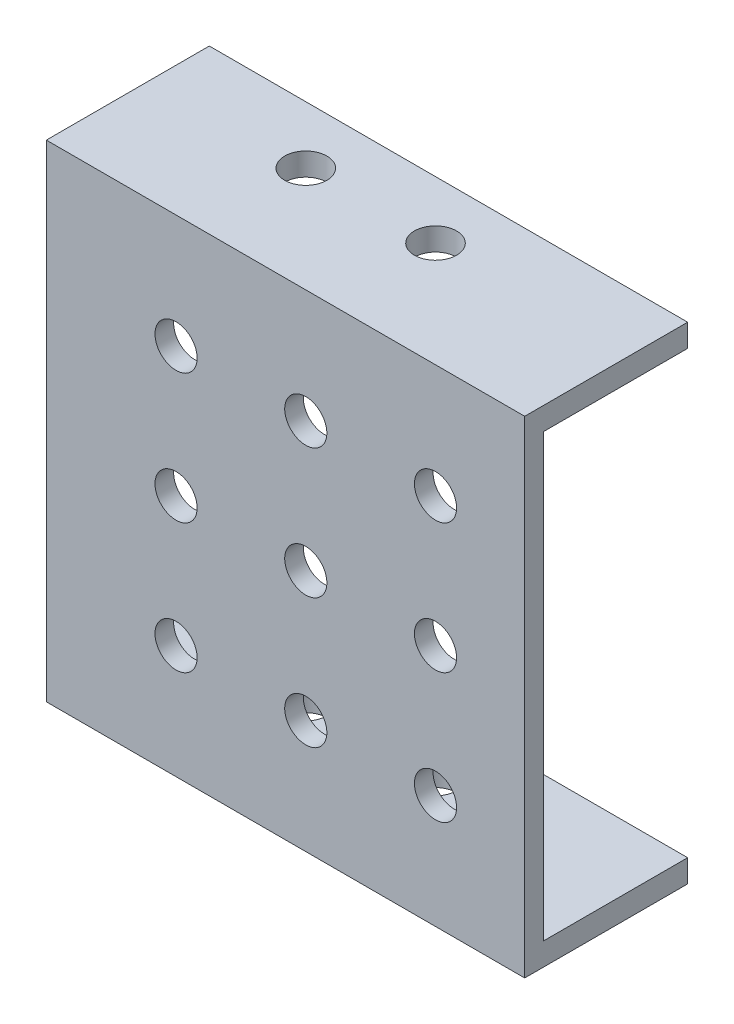
ISO-10303-21;
HEADER;
FILE_DESCRIPTION(('STEP AP214'),'2;1');
FILE_NAME('part.step','',(''),(''),'','','');
FILE_SCHEMA(('AUTOMOTIVE_DESIGN { 1 0 10303 214 1 1 1 1 }'));
ENDSEC;
DATA;
#1=APPLICATION_CONTEXT('core data for automotive mechanical design processes');
#2=APPLICATION_PROTOCOL_DEFINITION('international standard','automotive_design',2000,#1);
#3=PRODUCT_CONTEXT('',#1,'mechanical');
#4=PRODUCT('Part','Part','',(#3));
#5=PRODUCT_RELATED_PRODUCT_CATEGORY('part','',(#4));
#6=PRODUCT_DEFINITION_FORMATION('','',#4);
#7=PRODUCT_DEFINITION_CONTEXT('part definition',#1,'design');
#8=PRODUCT_DEFINITION('design','',#6,#7);
#9=PRODUCT_DEFINITION_SHAPE('','',#8);
#10=(LENGTH_UNIT() NAMED_UNIT(*) SI_UNIT(.MILLI.,.METRE.));
#11=(NAMED_UNIT(*) PLANE_ANGLE_UNIT() SI_UNIT($,.RADIAN.));
#12=(NAMED_UNIT(*) SI_UNIT($,.STERADIAN.) SOLID_ANGLE_UNIT());
#13=UNCERTAINTY_MEASURE_WITH_UNIT(LENGTH_MEASURE(1.E-05),#10,'distance_accuracy_value','');
#14=(GEOMETRIC_REPRESENTATION_CONTEXT(3) GLOBAL_UNCERTAINTY_ASSIGNED_CONTEXT((#13)) GLOBAL_UNIT_ASSIGNED_CONTEXT((#10,
#11,#12)) REPRESENTATION_CONTEXT('',''));
#15=CARTESIAN_POINT('',(0.,0.,0.));
#16=DIRECTION('',(0.,0.,1.));
#17=DIRECTION('',(1.,0.,0.));
#18=AXIS2_PLACEMENT_3D('',#15,#16,#17);
#19=CARTESIAN_POINT('',(-147.5,0.,0.));
#20=DIRECTION('',(0.,0.,1.));
#21=DIRECTION('',(1.,0.,0.));
#22=AXIS2_PLACEMENT_3D('',#19,#20,#21);
#23=PLANE('',#22);
#24=CARTESIAN_POINT('',(12.5,70.,0.));
#25=DIRECTION('',(0.,0.,1.));
#26=DIRECTION('',(1.,0.,0.));
#27=AXIS2_PLACEMENT_3D('',#24,#25,#26);
#28=CIRCLE('',#27,13.);
#29=CARTESIAN_POINT('',(25.5,70.,0.));
#30=VERTEX_POINT('',#29);
#31=EDGE_CURVE('E223',#30,#30,#28,.T.);
#32=ORIENTED_EDGE('',*,*,#31,.T.);
#33=EDGE_LOOP('',(#32));
#34=FACE_BOUND('',#33,.T.);
#35=CARTESIAN_POINT('',(-67.4999999999999,150.,0.));
#36=DIRECTION('',(0.,0.,1.));
#37=DIRECTION('',(1.,0.,0.));
#38=AXIS2_PLACEMENT_3D('',#35,#36,#37);
#39=CIRCLE('',#38,13.);
#40=CARTESIAN_POINT('',(-54.4999999999999,150.,0.));
#41=VERTEX_POINT('',#40);
#42=EDGE_CURVE('E235',#41,#41,#39,.T.);
#43=ORIENTED_EDGE('',*,*,#42,.T.);
#44=EDGE_LOOP('',(#43));
#45=FACE_BOUND('',#44,.T.);
#46=CARTESIAN_POINT('',(12.5,230.,0.));
#47=DIRECTION('',(0.,0.,1.));
#48=DIRECTION('',(1.,0.,0.));
#49=AXIS2_PLACEMENT_3D('',#46,#47,#48);
#50=CIRCLE('',#49,13.);
#51=CARTESIAN_POINT('',(25.5,230.,0.));
#52=VERTEX_POINT('',#51);
#53=EDGE_CURVE('E245',#52,#52,#50,.T.);
#54=ORIENTED_EDGE('',*,*,#53,.T.);
#55=EDGE_LOOP('',(#54));
#56=FACE_BOUND('',#55,.T.);
#57=CARTESIAN_POINT('',(92.5,150.,0.));
#58=DIRECTION('',(0.,0.,1.));
#59=DIRECTION('',(1.,0.,0.));
#60=AXIS2_PLACEMENT_3D('',#57,#58,#59);
#61=CIRCLE('',#60,13.);
#62=CARTESIAN_POINT('',(105.5,150.,0.));
#63=VERTEX_POINT('',#62);
#64=EDGE_CURVE('E255',#63,#63,#61,.T.);
#65=ORIENTED_EDGE('',*,*,#64,.T.);
#66=EDGE_LOOP('',(#65));
#67=FACE_BOUND('',#66,.T.);
#68=CARTESIAN_POINT('',(92.5,230.,0.));
#69=DIRECTION('',(0.,0.,1.));
#70=DIRECTION('',(1.,0.,0.));
#71=AXIS2_PLACEMENT_3D('',#68,#69,#70);
#72=CIRCLE('',#71,13.);
#73=CARTESIAN_POINT('',(105.5,230.,0.));
#74=VERTEX_POINT('',#73);
#75=EDGE_CURVE('E196',#74,#74,#72,.T.);
#76=ORIENTED_EDGE('',*,*,#75,.T.);
#77=EDGE_LOOP('',(#76));
#78=FACE_BOUND('',#77,.T.);
#79=CARTESIAN_POINT('',(92.5,70.,0.));
#80=DIRECTION('',(0.,0.,1.));
#81=DIRECTION('',(1.,0.,0.));
#82=AXIS2_PLACEMENT_3D('',#79,#80,#81);
#83=CIRCLE('',#82,13.);
#84=CARTESIAN_POINT('',(105.5,70.,0.));
#85=VERTEX_POINT('',#84);
#86=EDGE_CURVE('E251',#85,#85,#83,.T.);
#87=ORIENTED_EDGE('',*,*,#86,.T.);
#88=EDGE_LOOP('',(#87));
#89=FACE_BOUND('',#88,.T.);
#90=CARTESIAN_POINT('',(-67.4999999999999,230.,0.));
#91=DIRECTION('',(0.,0.,1.));
#92=DIRECTION('',(1.,0.,0.));
#93=AXIS2_PLACEMENT_3D('',#90,#91,#92);
#94=CIRCLE('',#93,13.);
#95=CARTESIAN_POINT('',(-54.4999999999999,230.,0.));
#96=VERTEX_POINT('',#95);
#97=EDGE_CURVE('E241',#96,#96,#94,.T.);
#98=ORIENTED_EDGE('',*,*,#97,.T.);
#99=EDGE_LOOP('',(#98));
#100=FACE_BOUND('',#99,.T.);
#101=CARTESIAN_POINT('',(-67.4999999999999,70.,0.));
#102=DIRECTION('',(0.,0.,1.));
#103=DIRECTION('',(1.,0.,0.));
#104=AXIS2_PLACEMENT_3D('',#101,#102,#103);
#105=CIRCLE('',#104,13.);
#106=CARTESIAN_POINT('',(-54.5,70.,0.));
#107=VERTEX_POINT('',#106);
#108=EDGE_CURVE('E232',#107,#107,#105,.T.);
#109=ORIENTED_EDGE('',*,*,#108,.T.);
#110=EDGE_LOOP('',(#109));
#111=FACE_BOUND('',#110,.T.);
#112=CARTESIAN_POINT('',(12.5,150.,0.));
#113=DIRECTION('',(0.,0.,1.));
#114=DIRECTION('',(1.,0.,0.));
#115=AXIS2_PLACEMENT_3D('',#112,#113,#114);
#116=CIRCLE('',#115,13.);
#117=CARTESIAN_POINT('',(25.5,150.,0.));
#118=VERTEX_POINT('',#117);
#119=EDGE_CURVE('E162',#118,#118,#116,.T.);
#120=ORIENTED_EDGE('',*,*,#119,.T.);
#121=EDGE_LOOP('',(#120));
#122=FACE_BOUND('',#121,.T.);
#123=DIRECTION('',(1.,0.,0.));
#124=VECTOR('',#123,1.);
#125=CARTESIAN_POINT('',(147.5,14.,0.));
#126=LINE('',#125,#124);
#127=CARTESIAN_POINT('',(-147.5,14.,0.));
#128=VERTEX_POINT('',#127);
#129=CARTESIAN_POINT('',(147.5,14.,0.));
#130=VERTEX_POINT('',#129);
#131=EDGE_CURVE('E120',#128,#130,#126,.T.);
#132=ORIENTED_EDGE('',*,*,#131,.F.);
#133=DIRECTION('',(0.,-1.,0.));
#134=VECTOR('',#133,1.);
#135=CARTESIAN_POINT('',(-147.5,300.,0.));
#136=LINE('',#135,#134);
#137=CARTESIAN_POINT('',(-147.5,286.,0.));
#138=VERTEX_POINT('',#137);
#139=EDGE_CURVE('E153',#138,#128,#136,.T.);
#140=ORIENTED_EDGE('',*,*,#139,.F.);
#141=DIRECTION('',(-1.,0.,0.));
#142=VECTOR('',#141,1.);
#143=CARTESIAN_POINT('',(147.5,286.,0.));
#144=LINE('',#143,#142);
#145=CARTESIAN_POINT('',(147.5,286.,0.));
#146=VERTEX_POINT('',#145);
#147=EDGE_CURVE('E132',#146,#138,#144,.T.);
#148=ORIENTED_EDGE('',*,*,#147,.F.);
#149=DIRECTION('',(0.,1.,0.));
#150=VECTOR('',#149,1.);
#151=CARTESIAN_POINT('',(147.5,300.,0.));
#152=LINE('',#151,#150);
#153=EDGE_CURVE('E56',#130,#146,#152,.T.);
#154=ORIENTED_EDGE('',*,*,#153,.F.);
#155=EDGE_LOOP('',(#132,#140,#148,#154));
#156=FACE_BOUND('',#155,.T.);
#157=ADVANCED_FACE('F34',(#34,#45,#56,#67,#78,#89,#100,#111,#122,#156),#23,.F.);
#158=CARTESIAN_POINT('',(-147.5,0.,11.5));
#159=DIRECTION('',(0.,0.,1.));
#160=DIRECTION('',(1.,0.,0.));
#161=AXIS2_PLACEMENT_3D('',#158,#159,#160);
#162=PLANE('',#161);
#163=CARTESIAN_POINT('',(12.5,70.,11.5));
#164=DIRECTION('',(0.,0.,1.));
#165=DIRECTION('',(1.,0.,0.));
#166=AXIS2_PLACEMENT_3D('',#163,#164,#165);
#167=CIRCLE('',#166,13.);
#168=CARTESIAN_POINT('',(25.5,70.,11.5));
#169=VERTEX_POINT('',#168);
#170=EDGE_CURVE('E225',#169,#169,#167,.T.);
#171=ORIENTED_EDGE('',*,*,#170,.F.);
#172=EDGE_LOOP('',(#171));
#173=FACE_BOUND('',#172,.T.);
#174=CARTESIAN_POINT('',(-67.4999999999999,150.,11.5));
#175=DIRECTION('',(0.,0.,1.));
#176=DIRECTION('',(1.,0.,0.));
#177=AXIS2_PLACEMENT_3D('',#174,#175,#176);
#178=CIRCLE('',#177,13.);
#179=CARTESIAN_POINT('',(-54.4999999999999,150.,11.5));
#180=VERTEX_POINT('',#179);
#181=EDGE_CURVE('E238',#180,#180,#178,.T.);
#182=ORIENTED_EDGE('',*,*,#181,.F.);
#183=EDGE_LOOP('',(#182));
#184=FACE_BOUND('',#183,.T.);
#185=CARTESIAN_POINT('',(12.5,230.,11.5));
#186=DIRECTION('',(0.,0.,1.));
#187=DIRECTION('',(1.,0.,0.));
#188=AXIS2_PLACEMENT_3D('',#185,#186,#187);
#189=CIRCLE('',#188,13.);
#190=CARTESIAN_POINT('',(25.5,230.,11.5));
#191=VERTEX_POINT('',#190);
#192=EDGE_CURVE('E248',#191,#191,#189,.T.);
#193=ORIENTED_EDGE('',*,*,#192,.F.);
#194=EDGE_LOOP('',(#193));
#195=FACE_BOUND('',#194,.T.);
#196=CARTESIAN_POINT('',(92.5,150.,11.5));
#197=DIRECTION('',(0.,0.,1.));
#198=DIRECTION('',(1.,0.,0.));
#199=AXIS2_PLACEMENT_3D('',#196,#197,#198);
#200=CIRCLE('',#199,13.);
#201=CARTESIAN_POINT('',(105.5,150.,11.5));
#202=VERTEX_POINT('',#201);
#203=EDGE_CURVE('E258',#202,#202,#200,.T.);
#204=ORIENTED_EDGE('',*,*,#203,.F.);
#205=EDGE_LOOP('',(#204));
#206=FACE_BOUND('',#205,.T.);
#207=DIRECTION('',(0.,-1.,0.));
#208=VECTOR('',#207,1.);
#209=CARTESIAN_POINT('',(-147.5,300.,11.5));
#210=LINE('',#209,#208);
#211=CARTESIAN_POINT('',(-147.5,300.,11.5));
#212=VERTEX_POINT('',#211);
#213=CARTESIAN_POINT('',(-147.5,0.,11.5));
#214=VERTEX_POINT('',#213);
#215=EDGE_CURVE('E166',#212,#214,#210,.T.);
#216=ORIENTED_EDGE('',*,*,#215,.T.);
#217=DIRECTION('',(1.,0.,0.));
#218=VECTOR('',#217,1.);
#219=CARTESIAN_POINT('',(-147.5,0.,11.5));
#220=LINE('',#219,#218);
#221=CARTESIAN_POINT('',(147.5,0.,11.5));
#222=VERTEX_POINT('',#221);
#223=EDGE_CURVE('E192',#214,#222,#220,.T.);
#224=ORIENTED_EDGE('',*,*,#223,.T.);
#225=DIRECTION('',(0.,1.,0.));
#226=VECTOR('',#225,1.);
#227=CARTESIAN_POINT('',(147.5,300.,11.5));
#228=LINE('',#227,#226);
#229=CARTESIAN_POINT('',(147.5,300.,11.5));
#230=VERTEX_POINT('',#229);
#231=EDGE_CURVE('E105',#222,#230,#228,.T.);
#232=ORIENTED_EDGE('',*,*,#231,.T.);
#233=DIRECTION('',(-1.,0.,0.));
#234=VECTOR('',#233,1.);
#235=CARTESIAN_POINT('',(-147.5,300.,11.5));
#236=LINE('',#235,#234);
#237=EDGE_CURVE('E174',#230,#212,#236,.T.);
#238=ORIENTED_EDGE('',*,*,#237,.T.);
#239=EDGE_LOOP('',(#216,#224,#232,#238));
#240=FACE_BOUND('',#239,.T.);
#241=CARTESIAN_POINT('',(92.5,230.,11.5));
#242=DIRECTION('',(0.,0.,1.));
#243=DIRECTION('',(1.,0.,0.));
#244=AXIS2_PLACEMENT_3D('',#241,#242,#243);
#245=CIRCLE('',#244,13.);
#246=CARTESIAN_POINT('',(105.5,230.,11.5));
#247=VERTEX_POINT('',#246);
#248=EDGE_CURVE('E207',#247,#247,#245,.T.);
#249=ORIENTED_EDGE('',*,*,#248,.F.);
#250=EDGE_LOOP('',(#249));
#251=FACE_BOUND('',#250,.T.);
#252=CARTESIAN_POINT('',(92.5,70.,11.5));
#253=DIRECTION('',(0.,0.,1.));
#254=DIRECTION('',(1.,0.,0.));
#255=AXIS2_PLACEMENT_3D('',#252,#253,#254);
#256=CIRCLE('',#255,13.);
#257=CARTESIAN_POINT('',(105.5,70.,11.5));
#258=VERTEX_POINT('',#257);
#259=EDGE_CURVE('E211',#258,#258,#256,.T.);
#260=ORIENTED_EDGE('',*,*,#259,.F.);
#261=EDGE_LOOP('',(#260));
#262=FACE_BOUND('',#261,.T.);
#263=CARTESIAN_POINT('',(-67.4999999999999,230.,11.5));
#264=DIRECTION('',(0.,0.,1.));
#265=DIRECTION('',(1.,0.,0.));
#266=AXIS2_PLACEMENT_3D('',#263,#264,#265);
#267=CIRCLE('',#266,13.);
#268=CARTESIAN_POINT('',(-54.4999999999999,230.,11.5));
#269=VERTEX_POINT('',#268);
#270=EDGE_CURVE('E215',#269,#269,#267,.T.);
#271=ORIENTED_EDGE('',*,*,#270,.F.);
#272=EDGE_LOOP('',(#271));
#273=FACE_BOUND('',#272,.T.);
#274=CARTESIAN_POINT('',(-67.4999999999999,70.,11.5));
#275=DIRECTION('',(0.,0.,1.));
#276=DIRECTION('',(1.,0.,0.));
#277=AXIS2_PLACEMENT_3D('',#274,#275,#276);
#278=CIRCLE('',#277,13.);
#279=CARTESIAN_POINT('',(-54.5,70.,11.5));
#280=VERTEX_POINT('',#279);
#281=EDGE_CURVE('E219',#280,#280,#278,.T.);
#282=ORIENTED_EDGE('',*,*,#281,.F.);
#283=EDGE_LOOP('',(#282));
#284=FACE_BOUND('',#283,.T.);
#285=CARTESIAN_POINT('',(12.5,150.,11.5));
#286=DIRECTION('',(0.,0.,1.));
#287=DIRECTION('',(1.,0.,0.));
#288=AXIS2_PLACEMENT_3D('',#285,#286,#287);
#289=CIRCLE('',#288,13.);
#290=CARTESIAN_POINT('',(25.5,150.,11.5));
#291=VERTEX_POINT('',#290);
#292=EDGE_CURVE('E147',#291,#291,#289,.T.);
#293=ORIENTED_EDGE('',*,*,#292,.F.);
#294=EDGE_LOOP('',(#293));
#295=FACE_BOUND('',#294,.T.);
#296=ADVANCED_FACE('F199',(#173,#184,#195,#206,#240,#251,#262,#273,#284,#295),#162,.T.);
#297=CARTESIAN_POINT('',(-147.5,300.,11.5));
#298=DIRECTION('',(1.,0.,0.));
#299=DIRECTION('',(0.,0.,-1.));
#300=AXIS2_PLACEMENT_3D('',#297,#298,#299);
#301=PLANE('',#300);
#302=DIRECTION('',(0.,0.,-1.));
#303=VECTOR('',#302,1.);
#304=CARTESIAN_POINT('',(-147.5,300.,11.5));
#305=LINE('',#304,#303);
#306=CARTESIAN_POINT('',(-147.5,300.,-89.));
#307=VERTEX_POINT('',#306);
#308=EDGE_CURVE('E172',#212,#307,#305,.T.);
#309=ORIENTED_EDGE('',*,*,#308,.T.);
#310=DIRECTION('',(0.,1.,0.));
#311=VECTOR('',#310,1.);
#312=CARTESIAN_POINT('',(-147.5,300.,-89.));
#313=LINE('',#312,#311);
#314=CARTESIAN_POINT('',(-147.5,286.,-89.));
#315=VERTEX_POINT('',#314);
#316=EDGE_CURVE('E138',#315,#307,#313,.T.);
#317=ORIENTED_EDGE('',*,*,#316,.F.);
#318=DIRECTION('',(0.,0.,1.));
#319=VECTOR('',#318,1.);
#320=CARTESIAN_POINT('',(-147.5,286.,-89.));
#321=LINE('',#320,#319);
#322=EDGE_CURVE('E144',#315,#138,#321,.T.);
#323=ORIENTED_EDGE('',*,*,#322,.T.);
#324=ORIENTED_EDGE('',*,*,#139,.T.);
#325=DIRECTION('',(0.,0.,1.));
#326=VECTOR('',#325,1.);
#327=CARTESIAN_POINT('',(-147.5,14.,-89.));
#328=LINE('',#327,#326);
#329=CARTESIAN_POINT('',(-147.5,14.,-89.));
#330=VERTEX_POINT('',#329);
#331=EDGE_CURVE('E130',#330,#128,#328,.T.);
#332=ORIENTED_EDGE('',*,*,#331,.F.);
#333=DIRECTION('',(0.,1.,0.));
#334=VECTOR('',#333,1.);
#335=CARTESIAN_POINT('',(-147.5,0.,-89.));
#336=LINE('',#335,#334);
#337=CARTESIAN_POINT('',(-147.5,0.,-89.));
#338=VERTEX_POINT('',#337);
#339=EDGE_CURVE('E115',#338,#330,#336,.T.);
#340=ORIENTED_EDGE('',*,*,#339,.F.);
#341=DIRECTION('',(0.,0.,-1.));
#342=VECTOR('',#341,1.);
#343=CARTESIAN_POINT('',(-147.5,0.,11.5));
#344=LINE('',#343,#342);
#345=EDGE_CURVE('E11',#214,#338,#344,.T.);
#346=ORIENTED_EDGE('',*,*,#345,.F.);
#347=ORIENTED_EDGE('',*,*,#215,.F.);
#348=EDGE_LOOP('',(#309,#317,#323,#324,#332,#340,#346,#347));
#349=FACE_BOUND('',#348,.T.);
#350=ADVANCED_FACE('F36',(#349),#301,.F.);
#351=CARTESIAN_POINT('',(-147.5,0.,11.5));
#352=DIRECTION('',(0.,1.,0.));
#353=DIRECTION('',(0.,0.,1.));
#354=AXIS2_PLACEMENT_3D('',#351,#352,#353);
#355=PLANE('',#354);
#356=CARTESIAN_POINT('',(-52.5,0.,-53.5));
#357=DIRECTION('',(0.,1.,0.));
#358=DIRECTION('',(0.,0.,1.));
#359=AXIS2_PLACEMENT_3D('',#356,#357,#358);
#360=CIRCLE('',#359,13.);
#361=CARTESIAN_POINT('',(-52.5,0.,-40.5));
#362=VERTEX_POINT('',#361);
#363=EDGE_CURVE('E297',#362,#362,#360,.T.);
#364=ORIENTED_EDGE('',*,*,#363,.T.);
#365=EDGE_LOOP('',(#364));
#366=FACE_BOUND('',#365,.T.);
#367=CARTESIAN_POINT('',(27.5,0.,-53.5));
#368=DIRECTION('',(0.,1.,0.));
#369=DIRECTION('',(0.,0.,1.));
#370=AXIS2_PLACEMENT_3D('',#367,#368,#369);
#371=CIRCLE('',#370,13.);
#372=CARTESIAN_POINT('',(27.5,0.,-40.5));
#373=VERTEX_POINT('',#372);
#374=EDGE_CURVE('E300',#373,#373,#371,.T.);
#375=ORIENTED_EDGE('',*,*,#374,.T.);
#376=EDGE_LOOP('',(#375));
#377=FACE_BOUND('',#376,.T.);
#378=ORIENTED_EDGE('',*,*,#345,.T.);
#379=DIRECTION('',(-1.,0.,0.));
#380=VECTOR('',#379,1.);
#381=CARTESIAN_POINT('',(147.5,0.,-89.));
#382=LINE('',#381,#380);
#383=CARTESIAN_POINT('',(147.5,0.,-89.));
#384=VERTEX_POINT('',#383);
#385=EDGE_CURVE('E110',#384,#338,#382,.T.);
#386=ORIENTED_EDGE('',*,*,#385,.F.);
#387=DIRECTION('',(0.,0.,-1.));
#388=VECTOR('',#387,1.);
#389=CARTESIAN_POINT('',(147.5,0.,11.5));
#390=LINE('',#389,#388);
#391=EDGE_CURVE('E43',#222,#384,#390,.T.);
#392=ORIENTED_EDGE('',*,*,#391,.F.);
#393=ORIENTED_EDGE('',*,*,#223,.F.);
#394=EDGE_LOOP('',(#378,#386,#392,#393));
#395=FACE_BOUND('',#394,.T.);
#396=ADVANCED_FACE('F111',(#366,#377,#395),#355,.F.);
#397=CARTESIAN_POINT('',(147.5,300.,11.5));
#398=DIRECTION('',(-1.,0.,0.));
#399=DIRECTION('',(0.,0.,1.));
#400=AXIS2_PLACEMENT_3D('',#397,#398,#399);
#401=PLANE('',#400);
#402=ORIENTED_EDGE('',*,*,#391,.T.);
#403=DIRECTION('',(0.,-1.,0.));
#404=VECTOR('',#403,1.);
#405=CARTESIAN_POINT('',(147.5,0.,-89.));
#406=LINE('',#405,#404);
#407=CARTESIAN_POINT('',(147.5,14.,-89.));
#408=VERTEX_POINT('',#407);
#409=EDGE_CURVE('E103',#408,#384,#406,.T.);
#410=ORIENTED_EDGE('',*,*,#409,.F.);
#411=DIRECTION('',(0.,0.,1.));
#412=VECTOR('',#411,1.);
#413=CARTESIAN_POINT('',(147.5,14.,-89.));
#414=LINE('',#413,#412);
#415=EDGE_CURVE('E51',#408,#130,#414,.T.);
#416=ORIENTED_EDGE('',*,*,#415,.T.);
#417=ORIENTED_EDGE('',*,*,#153,.T.);
#418=DIRECTION('',(0.,0.,1.));
#419=VECTOR('',#418,1.);
#420=CARTESIAN_POINT('',(147.5,286.,-89.));
#421=LINE('',#420,#419);
#422=CARTESIAN_POINT('',(147.5,286.,-89.));
#423=VERTEX_POINT('',#422);
#424=EDGE_CURVE('E157',#423,#146,#421,.T.);
#425=ORIENTED_EDGE('',*,*,#424,.F.);
#426=DIRECTION('',(0.,-1.,0.));
#427=VECTOR('',#426,1.);
#428=CARTESIAN_POINT('',(147.5,300.,-89.));
#429=LINE('',#428,#427);
#430=CARTESIAN_POINT('',(147.5,300.,-89.));
#431=VERTEX_POINT('',#430);
#432=EDGE_CURVE('E133',#431,#423,#429,.T.);
#433=ORIENTED_EDGE('',*,*,#432,.F.);
#434=DIRECTION('',(0.,0.,-1.));
#435=VECTOR('',#434,1.);
#436=CARTESIAN_POINT('',(147.5,300.,11.5));
#437=LINE('',#436,#435);
#438=EDGE_CURVE('E107',#230,#431,#437,.T.);
#439=ORIENTED_EDGE('',*,*,#438,.F.);
#440=ORIENTED_EDGE('',*,*,#231,.F.);
#441=EDGE_LOOP('',(#402,#410,#416,#417,#425,#433,#439,#440));
#442=FACE_BOUND('',#441,.T.);
#443=ADVANCED_FACE('F101',(#442),#401,.F.);
#444=CARTESIAN_POINT('',(-147.5,300.,11.5));
#445=DIRECTION('',(0.,-1.,0.));
#446=DIRECTION('',(0.,0.,-1.));
#447=AXIS2_PLACEMENT_3D('',#444,#445,#446);
#448=PLANE('',#447);
#449=CARTESIAN_POINT('',(-52.5,300.,-53.5));
#450=DIRECTION('',(0.,1.,0.));
#451=DIRECTION('',(0.,0.,1.));
#452=AXIS2_PLACEMENT_3D('',#449,#450,#451);
#453=CIRCLE('',#452,13.);
#454=CARTESIAN_POINT('',(-52.5,300.,-40.5));
#455=VERTEX_POINT('',#454);
#456=EDGE_CURVE('E310',#455,#455,#453,.T.);
#457=ORIENTED_EDGE('',*,*,#456,.F.);
#458=EDGE_LOOP('',(#457));
#459=FACE_BOUND('',#458,.T.);
#460=CARTESIAN_POINT('',(27.5,300.,-53.5));
#461=DIRECTION('',(0.,1.,0.));
#462=DIRECTION('',(0.,0.,1.));
#463=AXIS2_PLACEMENT_3D('',#460,#461,#462);
#464=CIRCLE('',#463,13.);
#465=CARTESIAN_POINT('',(27.5,300.,-40.5));
#466=VERTEX_POINT('',#465);
#467=EDGE_CURVE('E302',#466,#466,#464,.T.);
#468=ORIENTED_EDGE('',*,*,#467,.F.);
#469=EDGE_LOOP('',(#468));
#470=FACE_BOUND('',#469,.T.);
#471=ORIENTED_EDGE('',*,*,#438,.T.);
#472=DIRECTION('',(1.,0.,0.));
#473=VECTOR('',#472,1.);
#474=CARTESIAN_POINT('',(147.5,300.,-89.));
#475=LINE('',#474,#473);
#476=EDGE_CURVE('E141',#307,#431,#475,.T.);
#477=ORIENTED_EDGE('',*,*,#476,.F.);
#478=ORIENTED_EDGE('',*,*,#308,.F.);
#479=ORIENTED_EDGE('',*,*,#237,.F.);
#480=EDGE_LOOP('',(#471,#477,#478,#479));
#481=FACE_BOUND('',#480,.T.);
#482=ADVANCED_FACE('F178',(#459,#470,#481),#448,.F.);
#483=CARTESIAN_POINT('',(92.5,230.,11.5));
#484=DIRECTION('',(0.,0.,-1.));
#485=DIRECTION('',(-1.,0.,0.));
#486=AXIS2_PLACEMENT_3D('',#483,#484,#485);
#487=CYLINDRICAL_SURFACE('',#486,13.);
#488=ORIENTED_EDGE('',*,*,#248,.T.);
#489=EDGE_LOOP('',(#488));
#490=FACE_BOUND('',#489,.T.);
#491=ORIENTED_EDGE('',*,*,#75,.F.);
#492=EDGE_LOOP('',(#491));
#493=FACE_BOUND('',#492,.T.);
#494=ADVANCED_FACE('F268',(#490,#493),#487,.F.);
#495=CARTESIAN_POINT('',(92.5,150.,11.5));
#496=DIRECTION('',(0.,0.,-1.));
#497=DIRECTION('',(-1.,0.,0.));
#498=AXIS2_PLACEMENT_3D('',#495,#496,#497);
#499=CYLINDRICAL_SURFACE('',#498,13.);
#500=ORIENTED_EDGE('',*,*,#203,.T.);
#501=EDGE_LOOP('',(#500));
#502=FACE_BOUND('',#501,.T.);
#503=ORIENTED_EDGE('',*,*,#64,.F.);
#504=EDGE_LOOP('',(#503));
#505=FACE_BOUND('',#504,.T.);
#506=ADVANCED_FACE('F270',(#502,#505),#499,.F.);
#507=CARTESIAN_POINT('',(92.5,70.,11.5));
#508=DIRECTION('',(0.,0.,-1.));
#509=DIRECTION('',(-1.,0.,0.));
#510=AXIS2_PLACEMENT_3D('',#507,#508,#509);
#511=CYLINDRICAL_SURFACE('',#510,13.);
#512=ORIENTED_EDGE('',*,*,#259,.T.);
#513=EDGE_LOOP('',(#512));
#514=FACE_BOUND('',#513,.T.);
#515=ORIENTED_EDGE('',*,*,#86,.F.);
#516=EDGE_LOOP('',(#515));
#517=FACE_BOUND('',#516,.T.);
#518=ADVANCED_FACE('F276',(#514,#517),#511,.F.);
#519=CARTESIAN_POINT('',(12.5,230.,11.5));
#520=DIRECTION('',(0.,0.,-1.));
#521=DIRECTION('',(-1.,0.,0.));
#522=AXIS2_PLACEMENT_3D('',#519,#520,#521);
#523=CYLINDRICAL_SURFACE('',#522,13.);
#524=ORIENTED_EDGE('',*,*,#192,.T.);
#525=EDGE_LOOP('',(#524));
#526=FACE_BOUND('',#525,.T.);
#527=ORIENTED_EDGE('',*,*,#53,.F.);
#528=EDGE_LOOP('',(#527));
#529=FACE_BOUND('',#528,.T.);
#530=ADVANCED_FACE('F361',(#526,#529),#523,.F.);
#531=CARTESIAN_POINT('',(-67.4999999999999,230.,11.5));
#532=DIRECTION('',(0.,0.,-1.));
#533=DIRECTION('',(-1.,0.,0.));
#534=AXIS2_PLACEMENT_3D('',#531,#532,#533);
#535=CYLINDRICAL_SURFACE('',#534,13.);
#536=ORIENTED_EDGE('',*,*,#270,.T.);
#537=EDGE_LOOP('',(#536));
#538=FACE_BOUND('',#537,.T.);
#539=ORIENTED_EDGE('',*,*,#97,.F.);
#540=EDGE_LOOP('',(#539));
#541=FACE_BOUND('',#540,.T.);
#542=ADVANCED_FACE('F357',(#538,#541),#535,.F.);
#543=CARTESIAN_POINT('',(-67.4999999999999,150.,11.5));
#544=DIRECTION('',(0.,0.,-1.));
#545=DIRECTION('',(-1.,0.,0.));
#546=AXIS2_PLACEMENT_3D('',#543,#544,#545);
#547=CYLINDRICAL_SURFACE('',#546,13.);
#548=ORIENTED_EDGE('',*,*,#181,.T.);
#549=EDGE_LOOP('',(#548));
#550=FACE_BOUND('',#549,.T.);
#551=ORIENTED_EDGE('',*,*,#42,.F.);
#552=EDGE_LOOP('',(#551));
#553=FACE_BOUND('',#552,.T.);
#554=ADVANCED_FACE('F353',(#550,#553),#547,.F.);
#555=CARTESIAN_POINT('',(-67.4999999999999,70.,11.5));
#556=DIRECTION('',(0.,0.,-1.));
#557=DIRECTION('',(-1.,0.,0.));
#558=AXIS2_PLACEMENT_3D('',#555,#556,#557);
#559=CYLINDRICAL_SURFACE('',#558,13.);
#560=ORIENTED_EDGE('',*,*,#281,.T.);
#561=EDGE_LOOP('',(#560));
#562=FACE_BOUND('',#561,.T.);
#563=ORIENTED_EDGE('',*,*,#108,.F.);
#564=EDGE_LOOP('',(#563));
#565=FACE_BOUND('',#564,.T.);
#566=ADVANCED_FACE('F349',(#562,#565),#559,.F.);
#567=CARTESIAN_POINT('',(12.5,70.,11.5));
#568=DIRECTION('',(0.,0.,-1.));
#569=DIRECTION('',(-1.,0.,0.));
#570=AXIS2_PLACEMENT_3D('',#567,#568,#569);
#571=CYLINDRICAL_SURFACE('',#570,13.);
#572=ORIENTED_EDGE('',*,*,#170,.T.);
#573=EDGE_LOOP('',(#572));
#574=FACE_BOUND('',#573,.T.);
#575=ORIENTED_EDGE('',*,*,#31,.F.);
#576=EDGE_LOOP('',(#575));
#577=FACE_BOUND('',#576,.T.);
#578=ADVANCED_FACE('F346',(#574,#577),#571,.F.);
#579=CARTESIAN_POINT('',(12.5,150.,11.5));
#580=DIRECTION('',(0.,0.,-1.));
#581=DIRECTION('',(-1.,0.,0.));
#582=AXIS2_PLACEMENT_3D('',#579,#580,#581);
#583=CYLINDRICAL_SURFACE('',#582,13.);
#584=ORIENTED_EDGE('',*,*,#292,.T.);
#585=EDGE_LOOP('',(#584));
#586=FACE_BOUND('',#585,.T.);
#587=ORIENTED_EDGE('',*,*,#119,.F.);
#588=EDGE_LOOP('',(#587));
#589=FACE_BOUND('',#588,.T.);
#590=ADVANCED_FACE('F342',(#586,#589),#583,.F.);
#591=CARTESIAN_POINT('',(147.5,286.,-89.));
#592=DIRECTION('',(0.,1.,0.));
#593=DIRECTION('',(0.,0.,1.));
#594=AXIS2_PLACEMENT_3D('',#591,#592,#593);
#595=PLANE('',#594);
#596=CARTESIAN_POINT('',(-52.5,286.,-53.5));
#597=DIRECTION('',(0.,1.,0.));
#598=DIRECTION('',(0.,0.,1.));
#599=AXIS2_PLACEMENT_3D('',#596,#597,#598);
#600=CIRCLE('',#599,13.);
#601=CARTESIAN_POINT('',(-52.5,286.,-40.5));
#602=VERTEX_POINT('',#601);
#603=EDGE_CURVE('E306',#602,#602,#600,.T.);
#604=ORIENTED_EDGE('',*,*,#603,.T.);
#605=EDGE_LOOP('',(#604));
#606=FACE_BOUND('',#605,.T.);
#607=CARTESIAN_POINT('',(27.5,286.,-53.5));
#608=DIRECTION('',(0.,1.,0.));
#609=DIRECTION('',(0.,0.,1.));
#610=AXIS2_PLACEMENT_3D('',#607,#608,#609);
#611=CIRCLE('',#610,13.);
#612=CARTESIAN_POINT('',(27.5,286.,-40.5));
#613=VERTEX_POINT('',#612);
#614=EDGE_CURVE('E122',#613,#613,#611,.T.);
#615=ORIENTED_EDGE('',*,*,#614,.T.);
#616=EDGE_LOOP('',(#615));
#617=FACE_BOUND('',#616,.T.);
#618=ORIENTED_EDGE('',*,*,#147,.T.);
#619=ORIENTED_EDGE('',*,*,#322,.F.);
#620=DIRECTION('',(-1.,0.,0.));
#621=VECTOR('',#620,1.);
#622=CARTESIAN_POINT('',(147.5,286.,-89.));
#623=LINE('',#622,#621);
#624=EDGE_CURVE('E136',#423,#315,#623,.T.);
#625=ORIENTED_EDGE('',*,*,#624,.F.);
#626=ORIENTED_EDGE('',*,*,#424,.T.);
#627=EDGE_LOOP('',(#618,#619,#625,#626));
#628=FACE_BOUND('',#627,.T.);
#629=ADVANCED_FACE('F185',(#606,#617,#628),#595,.F.);
#630=CARTESIAN_POINT('',(147.5,286.,-89.));
#631=DIRECTION('',(0.,0.,-1.));
#632=DIRECTION('',(-1.,0.,0.));
#633=AXIS2_PLACEMENT_3D('',#630,#631,#632);
#634=PLANE('',#633);
#635=ORIENTED_EDGE('',*,*,#432,.T.);
#636=ORIENTED_EDGE('',*,*,#624,.T.);
#637=ORIENTED_EDGE('',*,*,#316,.T.);
#638=ORIENTED_EDGE('',*,*,#476,.T.);
#639=EDGE_LOOP('',(#635,#636,#637,#638));
#640=FACE_BOUND('',#639,.T.);
#641=ADVANCED_FACE('F182',(#640),#634,.T.);
#642=CARTESIAN_POINT('',(147.5,14.,-89.));
#643=DIRECTION('',(0.,-1.,0.));
#644=DIRECTION('',(1.,0.,0.));
#645=AXIS2_PLACEMENT_3D('',#642,#643,#644);
#646=PLANE('',#645);
#647=CARTESIAN_POINT('',(-52.5,14.,-53.5));
#648=DIRECTION('',(0.,-1.,0.));
#649=DIRECTION('',(1.,0.,0.));
#650=AXIS2_PLACEMENT_3D('',#647,#648,#649);
#651=CIRCLE('',#650,13.);
#652=CARTESIAN_POINT('',(-39.5,14.,-53.5));
#653=VERTEX_POINT('',#652);
#654=EDGE_CURVE('E38',#653,#653,#651,.T.);
#655=ORIENTED_EDGE('',*,*,#654,.T.);
#656=EDGE_LOOP('',(#655));
#657=FACE_BOUND('',#656,.T.);
#658=CARTESIAN_POINT('',(27.5,14.,-53.5));
#659=DIRECTION('',(0.,-1.,0.));
#660=DIRECTION('',(1.,0.,0.));
#661=AXIS2_PLACEMENT_3D('',#658,#659,#660);
#662=CIRCLE('',#661,13.);
#663=CARTESIAN_POINT('',(40.5,14.,-53.5));
#664=VERTEX_POINT('',#663);
#665=EDGE_CURVE('E167',#664,#664,#662,.T.);
#666=ORIENTED_EDGE('',*,*,#665,.T.);
#667=EDGE_LOOP('',(#666));
#668=FACE_BOUND('',#667,.T.);
#669=ORIENTED_EDGE('',*,*,#131,.T.);
#670=ORIENTED_EDGE('',*,*,#415,.F.);
#671=DIRECTION('',(1.,0.,0.));
#672=VECTOR('',#671,1.);
#673=CARTESIAN_POINT('',(147.5,14.,-89.));
#674=LINE('',#673,#672);
#675=EDGE_CURVE('E119',#330,#408,#674,.T.);
#676=ORIENTED_EDGE('',*,*,#675,.F.);
#677=ORIENTED_EDGE('',*,*,#331,.T.);
#678=EDGE_LOOP('',(#669,#670,#676,#677));
#679=FACE_BOUND('',#678,.T.);
#680=ADVANCED_FACE('F316',(#657,#668,#679),#646,.F.);
#681=CARTESIAN_POINT('',(147.5,0.,-89.));
#682=DIRECTION('',(0.,0.,1.));
#683=DIRECTION('',(1.,0.,0.));
#684=AXIS2_PLACEMENT_3D('',#681,#682,#683);
#685=PLANE('',#684);
#686=ORIENTED_EDGE('',*,*,#409,.T.);
#687=ORIENTED_EDGE('',*,*,#385,.T.);
#688=ORIENTED_EDGE('',*,*,#339,.T.);
#689=ORIENTED_EDGE('',*,*,#675,.T.);
#690=EDGE_LOOP('',(#686,#687,#688,#689));
#691=FACE_BOUND('',#690,.T.);
#692=ADVANCED_FACE('F117',(#691),#685,.F.);
#693=CARTESIAN_POINT('',(27.5,0.,-53.5));
#694=DIRECTION('',(0.,1.,0.));
#695=DIRECTION('',(0.,0.,1.));
#696=AXIS2_PLACEMENT_3D('',#693,#694,#695);
#697=CYLINDRICAL_SURFACE('',#696,13.);
#698=ORIENTED_EDGE('',*,*,#374,.F.);
#699=EDGE_LOOP('',(#698));
#700=FACE_BOUND('',#699,.T.);
#701=ORIENTED_EDGE('',*,*,#665,.F.);
#702=EDGE_LOOP('',(#701));
#703=FACE_BOUND('',#702,.T.);
#704=ADVANCED_FACE('F330',(#700,#703),#697,.F.);
#705=ORIENTED_EDGE('',*,*,#467,.T.);
#706=EDGE_LOOP('',(#705));
#707=FACE_BOUND('',#706,.T.);
#708=ORIENTED_EDGE('',*,*,#614,.F.);
#709=EDGE_LOOP('',(#708));
#710=FACE_BOUND('',#709,.T.);
#711=ADVANCED_FACE('F322',(#707,#710),#697,.F.);
#712=CARTESIAN_POINT('',(-52.5,0.,-53.5));
#713=DIRECTION('',(0.,1.,0.));
#714=DIRECTION('',(0.,0.,1.));
#715=AXIS2_PLACEMENT_3D('',#712,#713,#714);
#716=CYLINDRICAL_SURFACE('',#715,13.);
#717=ORIENTED_EDGE('',*,*,#363,.F.);
#718=EDGE_LOOP('',(#717));
#719=FACE_BOUND('',#718,.T.);
#720=ORIENTED_EDGE('',*,*,#654,.F.);
#721=EDGE_LOOP('',(#720));
#722=FACE_BOUND('',#721,.T.);
#723=ADVANCED_FACE('F319',(#719,#722),#716,.F.);
#724=ORIENTED_EDGE('',*,*,#456,.T.);
#725=EDGE_LOOP('',(#724));
#726=FACE_BOUND('',#725,.T.);
#727=ORIENTED_EDGE('',*,*,#603,.F.);
#728=EDGE_LOOP('',(#727));
#729=FACE_BOUND('',#728,.T.);
#730=ADVANCED_FACE('F321',(#726,#729),#716,.F.);
#731=CLOSED_SHELL('',(#157,#296,#350,#396,#443,#482,#494,#506,#518,#530,#542,#554,#566,#578,
#590,#629,#641,#680,#692,#704,#711,#723,#730));
#732=MANIFOLD_SOLID_BREP('B2',#731);
#733=ADVANCED_BREP_SHAPE_REPRESENTATION('',(#18,#732),#14);
#734=SHAPE_DEFINITION_REPRESENTATION(#9,#733);
ENDSEC;
END-ISO-10303-21;
